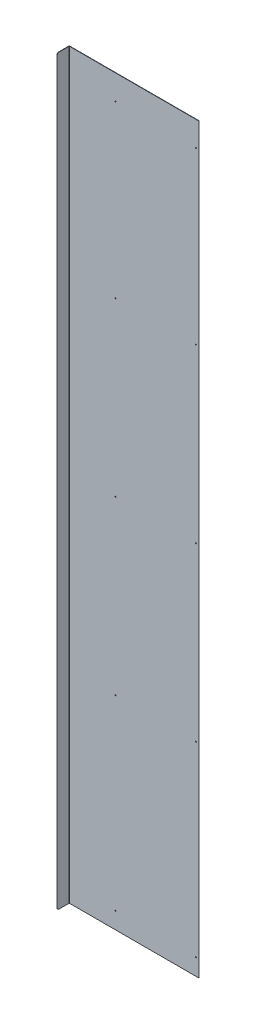
ISO-10303-21;
HEADER;
FILE_DESCRIPTION(('STEP AP214'),'2;1');
FILE_NAME('part.step','',(''),(''),'','','');
FILE_SCHEMA(('AUTOMOTIVE_DESIGN { 1 0 10303 214 1 1 1 1 }'));
ENDSEC;
DATA;
#1=APPLICATION_CONTEXT('core data for automotive mechanical design processes');
#2=APPLICATION_PROTOCOL_DEFINITION('international standard','automotive_design',2000,#1);
#3=PRODUCT_CONTEXT('',#1,'mechanical');
#4=PRODUCT('Part','Part','',(#3));
#5=PRODUCT_RELATED_PRODUCT_CATEGORY('part','',(#4));
#6=PRODUCT_DEFINITION_FORMATION('','',#4);
#7=PRODUCT_DEFINITION_CONTEXT('part definition',#1,'design');
#8=PRODUCT_DEFINITION('design','',#6,#7);
#9=PRODUCT_DEFINITION_SHAPE('','',#8);
#10=(LENGTH_UNIT() NAMED_UNIT(*) SI_UNIT(.MILLI.,.METRE.));
#11=(NAMED_UNIT(*) PLANE_ANGLE_UNIT() SI_UNIT($,.RADIAN.));
#12=(NAMED_UNIT(*) SI_UNIT($,.STERADIAN.) SOLID_ANGLE_UNIT());
#13=UNCERTAINTY_MEASURE_WITH_UNIT(LENGTH_MEASURE(1.E-05),#10,'distance_accuracy_value','');
#14=(GEOMETRIC_REPRESENTATION_CONTEXT(3) GLOBAL_UNCERTAINTY_ASSIGNED_CONTEXT((#13)) GLOBAL_UNIT_ASSIGNED_CONTEXT((#10,
#11,#12)) REPRESENTATION_CONTEXT('',''));
#15=CARTESIAN_POINT('',(0.,0.,0.));
#16=DIRECTION('',(0.,0.,1.));
#17=DIRECTION('',(1.,0.,0.));
#18=AXIS2_PLACEMENT_3D('',#15,#16,#17);
#19=CARTESIAN_POINT('',(312.642213333332,-25.,408.));
#20=DIRECTION('',(1.,0.,0.));
#21=DIRECTION('',(0.,1.,0.));
#22=AXIS2_PLACEMENT_3D('',#19,#20,#21);
#23=PLANE('',#22);
#24=DIRECTION('',(0.,1.,0.));
#25=VECTOR('',#24,1.);
#26=CARTESIAN_POINT('',(312.642213333332,0.,-0.8128));
#27=LINE('',#26,#25);
#28=CARTESIAN_POINT('',(312.642213333332,0.,-0.8128));
#29=VERTEX_POINT('',#28);
#30=CARTESIAN_POINT('',(312.642213333332,1790.7,-0.8128));
#31=VERTEX_POINT('',#30);
#32=EDGE_CURVE('E399',#29,#31,#27,.T.);
#33=ORIENTED_EDGE('',*,*,#32,.T.);
#34=DIRECTION('',(0.,0.,-1.));
#35=VECTOR('',#34,1.);
#36=CARTESIAN_POINT('',(312.642213333332,1790.7,-0.8128));
#37=LINE('',#36,#35);
#38=CARTESIAN_POINT('',(312.642213333332,1790.7,0.));
#39=VERTEX_POINT('',#38);
#40=EDGE_CURVE('E186',#39,#31,#37,.T.);
#41=ORIENTED_EDGE('',*,*,#40,.F.);
#42=DIRECTION('',(0.,1.,0.));
#43=VECTOR('',#42,1.);
#44=CARTESIAN_POINT('',(312.642213333332,0.,0.));
#45=LINE('',#44,#43);
#46=CARTESIAN_POINT('',(312.642213333332,0.,0.));
#47=VERTEX_POINT('',#46);
#48=EDGE_CURVE('E142',#47,#39,#45,.T.);
#49=ORIENTED_EDGE('',*,*,#48,.F.);
#50=DIRECTION('',(0.,0.,1.));
#51=VECTOR('',#50,1.);
#52=CARTESIAN_POINT('',(312.642213333332,0.,-0.8128));
#53=LINE('',#52,#51);
#54=EDGE_CURVE('E178',#29,#47,#53,.T.);
#55=ORIENTED_EDGE('',*,*,#54,.F.);
#56=EDGE_LOOP('',(#33,#41,#49,#55));
#57=FACE_BOUND('',#56,.T.);
#58=ADVANCED_FACE('F17',(#57),#23,.T.);
#59=CARTESIAN_POINT('',(305.642213329999,40.,0.));
#60=DIRECTION('',(0.,0.,1.));
#61=DIRECTION('',(1.,0.,0.));
#62=AXIS2_PLACEMENT_3D('',#59,#60,#61);
#63=CYLINDRICAL_SURFACE('',#62,1.21919999999998);
#64=CARTESIAN_POINT('',(305.642213329999,40.,0.));
#65=DIRECTION('',(0.,0.,1.));
#66=DIRECTION('',(1.,0.,0.));
#67=AXIS2_PLACEMENT_3D('',#64,#65,#66);
#68=CIRCLE('',#67,1.21919999999998);
#69=CARTESIAN_POINT('',(306.861413329999,40.,0.));
#70=VERTEX_POINT('',#69);
#71=EDGE_CURVE('E174',#70,#70,#68,.T.);
#72=ORIENTED_EDGE('',*,*,#71,.T.);
#73=EDGE_LOOP('',(#72));
#74=FACE_BOUND('',#73,.T.);
#75=CARTESIAN_POINT('',(305.642213329999,40.,-0.8128));
#76=DIRECTION('',(0.,0.,1.));
#77=DIRECTION('',(1.,0.,0.));
#78=AXIS2_PLACEMENT_3D('',#75,#76,#77);
#79=CIRCLE('',#78,1.21919999999998);
#80=CARTESIAN_POINT('',(306.861413329999,40.,-0.8128));
#81=VERTEX_POINT('',#80);
#82=EDGE_CURVE('E389',#81,#81,#79,.T.);
#83=ORIENTED_EDGE('',*,*,#82,.F.);
#84=EDGE_LOOP('',(#83));
#85=FACE_BOUND('',#84,.T.);
#86=ADVANCED_FACE('F355',(#74,#85),#63,.F.);
#87=CARTESIAN_POINT('',(111.558879999999,40.,0.));
#88=DIRECTION('',(0.,0.,1.));
#89=DIRECTION('',(1.,0.,0.));
#90=AXIS2_PLACEMENT_3D('',#87,#88,#89);
#91=CYLINDRICAL_SURFACE('',#90,1.2192);
#92=CARTESIAN_POINT('',(111.558879999999,40.,0.));
#93=DIRECTION('',(0.,0.,1.));
#94=DIRECTION('',(1.,0.,0.));
#95=AXIS2_PLACEMENT_3D('',#92,#93,#94);
#96=CIRCLE('',#95,1.2192);
#97=CARTESIAN_POINT('',(112.778079999999,40.,0.));
#98=VERTEX_POINT('',#97);
#99=EDGE_CURVE('E173',#98,#98,#96,.T.);
#100=ORIENTED_EDGE('',*,*,#99,.T.);
#101=EDGE_LOOP('',(#100));
#102=FACE_BOUND('',#101,.T.);
#103=CARTESIAN_POINT('',(111.558879999999,40.,-0.8128));
#104=DIRECTION('',(0.,0.,1.));
#105=DIRECTION('',(1.,0.,0.));
#106=AXIS2_PLACEMENT_3D('',#103,#104,#105);
#107=CIRCLE('',#106,1.2192);
#108=CARTESIAN_POINT('',(112.778079999999,40.,-0.8128));
#109=VERTEX_POINT('',#108);
#110=EDGE_CURVE('E124',#109,#109,#107,.T.);
#111=ORIENTED_EDGE('',*,*,#110,.F.);
#112=EDGE_LOOP('',(#111));
#113=FACE_BOUND('',#112,.T.);
#114=ADVANCED_FACE('F446',(#102,#113),#91,.F.);
#115=CARTESIAN_POINT('',(111.558879999999,490.,0.));
#116=DIRECTION('',(0.,0.,1.));
#117=DIRECTION('',(1.,0.,0.));
#118=AXIS2_PLACEMENT_3D('',#115,#116,#117);
#119=CYLINDRICAL_SURFACE('',#118,1.2192);
#120=CARTESIAN_POINT('',(111.558879999999,490.,0.));
#121=DIRECTION('',(0.,0.,1.));
#122=DIRECTION('',(1.,0.,0.));
#123=AXIS2_PLACEMENT_3D('',#120,#121,#122);
#124=CIRCLE('',#123,1.2192);
#125=CARTESIAN_POINT('',(112.778079999999,490.,0.));
#126=VERTEX_POINT('',#125);
#127=EDGE_CURVE('E169',#126,#126,#124,.T.);
#128=ORIENTED_EDGE('',*,*,#127,.T.);
#129=EDGE_LOOP('',(#128));
#130=FACE_BOUND('',#129,.T.);
#131=CARTESIAN_POINT('',(111.558879999999,490.,-0.8128));
#132=DIRECTION('',(0.,0.,1.));
#133=DIRECTION('',(1.,0.,0.));
#134=AXIS2_PLACEMENT_3D('',#131,#132,#133);
#135=CIRCLE('',#134,1.2192);
#136=CARTESIAN_POINT('',(112.778079999999,490.,-0.8128));
#137=VERTEX_POINT('',#136);
#138=EDGE_CURVE('E120',#137,#137,#135,.T.);
#139=ORIENTED_EDGE('',*,*,#138,.F.);
#140=EDGE_LOOP('',(#139));
#141=FACE_BOUND('',#140,.T.);
#142=ADVANCED_FACE('F449',(#130,#141),#119,.F.);
#143=CARTESIAN_POINT('',(305.642213329999,490.,0.));
#144=DIRECTION('',(0.,0.,1.));
#145=DIRECTION('',(1.,0.,0.));
#146=AXIS2_PLACEMENT_3D('',#143,#144,#145);
#147=CYLINDRICAL_SURFACE('',#146,1.21919999999998);
#148=CARTESIAN_POINT('',(305.642213329999,490.,0.));
#149=DIRECTION('',(0.,0.,1.));
#150=DIRECTION('',(1.,0.,0.));
#151=AXIS2_PLACEMENT_3D('',#148,#149,#150);
#152=CIRCLE('',#151,1.21919999999998);
#153=CARTESIAN_POINT('',(306.861413329999,490.,0.));
#154=VERTEX_POINT('',#153);
#155=EDGE_CURVE('E168',#154,#154,#152,.T.);
#156=ORIENTED_EDGE('',*,*,#155,.T.);
#157=EDGE_LOOP('',(#156));
#158=FACE_BOUND('',#157,.T.);
#159=CARTESIAN_POINT('',(305.642213329999,490.,-0.8128));
#160=DIRECTION('',(0.,0.,1.));
#161=DIRECTION('',(1.,0.,0.));
#162=AXIS2_PLACEMENT_3D('',#159,#160,#161);
#163=CIRCLE('',#162,1.21919999999998);
#164=CARTESIAN_POINT('',(306.861413329999,490.,-0.8128));
#165=VERTEX_POINT('',#164);
#166=EDGE_CURVE('E118',#165,#165,#163,.T.);
#167=ORIENTED_EDGE('',*,*,#166,.F.);
#168=EDGE_LOOP('',(#167));
#169=FACE_BOUND('',#168,.T.);
#170=ADVANCED_FACE('F503',(#158,#169),#147,.F.);
#171=CARTESIAN_POINT('',(305.642213329999,905.,0.));
#172=DIRECTION('',(0.,0.,1.));
#173=DIRECTION('',(1.,0.,0.));
#174=AXIS2_PLACEMENT_3D('',#171,#172,#173);
#175=CYLINDRICAL_SURFACE('',#174,1.21919999999998);
#176=CARTESIAN_POINT('',(305.642213329999,905.,0.));
#177=DIRECTION('',(0.,0.,1.));
#178=DIRECTION('',(1.,0.,0.));
#179=AXIS2_PLACEMENT_3D('',#176,#177,#178);
#180=CIRCLE('',#179,1.21919999999998);
#181=CARTESIAN_POINT('',(306.861413329999,905.,0.));
#182=VERTEX_POINT('',#181);
#183=EDGE_CURVE('E135',#182,#182,#180,.T.);
#184=ORIENTED_EDGE('',*,*,#183,.T.);
#185=EDGE_LOOP('',(#184));
#186=FACE_BOUND('',#185,.T.);
#187=CARTESIAN_POINT('',(305.642213329999,905.,-0.8128));
#188=DIRECTION('',(0.,0.,1.));
#189=DIRECTION('',(1.,0.,0.));
#190=AXIS2_PLACEMENT_3D('',#187,#188,#189);
#191=CIRCLE('',#190,1.21919999999998);
#192=CARTESIAN_POINT('',(306.861413329999,905.,-0.8128));
#193=VERTEX_POINT('',#192);
#194=EDGE_CURVE('E440',#193,#193,#191,.T.);
#195=ORIENTED_EDGE('',*,*,#194,.F.);
#196=EDGE_LOOP('',(#195));
#197=FACE_BOUND('',#196,.T.);
#198=ADVANCED_FACE('F507',(#186,#197),#175,.F.);
#199=CARTESIAN_POINT('',(111.558879999999,905.,0.));
#200=DIRECTION('',(0.,0.,1.));
#201=DIRECTION('',(1.,0.,0.));
#202=AXIS2_PLACEMENT_3D('',#199,#200,#201);
#203=CYLINDRICAL_SURFACE('',#202,1.2192);
#204=CARTESIAN_POINT('',(111.558879999999,905.,0.));
#205=DIRECTION('',(0.,0.,1.));
#206=DIRECTION('',(1.,0.,0.));
#207=AXIS2_PLACEMENT_3D('',#204,#205,#206);
#208=CIRCLE('',#207,1.2192);
#209=CARTESIAN_POINT('',(112.778079999999,905.,0.));
#210=VERTEX_POINT('',#209);
#211=EDGE_CURVE('E131',#210,#210,#208,.T.);
#212=ORIENTED_EDGE('',*,*,#211,.T.);
#213=EDGE_LOOP('',(#212));
#214=FACE_BOUND('',#213,.T.);
#215=CARTESIAN_POINT('',(111.558879999999,905.,-0.8128));
#216=DIRECTION('',(0.,0.,1.));
#217=DIRECTION('',(1.,0.,0.));
#218=AXIS2_PLACEMENT_3D('',#215,#216,#217);
#219=CIRCLE('',#218,1.2192);
#220=CARTESIAN_POINT('',(112.778079999999,905.,-0.8128));
#221=VERTEX_POINT('',#220);
#222=EDGE_CURVE('E411',#221,#221,#219,.T.);
#223=ORIENTED_EDGE('',*,*,#222,.F.);
#224=EDGE_LOOP('',(#223));
#225=FACE_BOUND('',#224,.T.);
#226=ADVANCED_FACE('F511',(#214,#225),#203,.F.);
#227=CARTESIAN_POINT('',(111.558879999999,1730.7,0.));
#228=DIRECTION('',(0.,0.,1.));
#229=DIRECTION('',(1.,0.,0.));
#230=AXIS2_PLACEMENT_3D('',#227,#228,#229);
#231=CYLINDRICAL_SURFACE('',#230,1.2192);
#232=CARTESIAN_POINT('',(111.558879999999,1730.7,0.));
#233=DIRECTION('',(0.,0.,1.));
#234=DIRECTION('',(1.,0.,0.));
#235=AXIS2_PLACEMENT_3D('',#232,#233,#234);
#236=CIRCLE('',#235,1.2192);
#237=CARTESIAN_POINT('',(112.778079999999,1730.7,0.));
#238=VERTEX_POINT('',#237);
#239=EDGE_CURVE('E136',#238,#238,#236,.T.);
#240=ORIENTED_EDGE('',*,*,#239,.T.);
#241=EDGE_LOOP('',(#240));
#242=FACE_BOUND('',#241,.T.);
#243=CARTESIAN_POINT('',(111.558879999999,1730.7,-0.8128));
#244=DIRECTION('',(0.,0.,1.));
#245=DIRECTION('',(1.,0.,0.));
#246=AXIS2_PLACEMENT_3D('',#243,#244,#245);
#247=CIRCLE('',#246,1.2192);
#248=CARTESIAN_POINT('',(112.778079999999,1730.7,-0.8128));
#249=VERTEX_POINT('',#248);
#250=EDGE_CURVE('E408',#249,#249,#247,.T.);
#251=ORIENTED_EDGE('',*,*,#250,.F.);
#252=EDGE_LOOP('',(#251));
#253=FACE_BOUND('',#252,.T.);
#254=ADVANCED_FACE('F513',(#242,#253),#231,.F.);
#255=CARTESIAN_POINT('',(305.642213329999,1730.7,0.));
#256=DIRECTION('',(0.,0.,1.));
#257=DIRECTION('',(1.,0.,0.));
#258=AXIS2_PLACEMENT_3D('',#255,#256,#257);
#259=CYLINDRICAL_SURFACE('',#258,1.21919999999998);
#260=CARTESIAN_POINT('',(305.642213329999,1730.7,0.));
#261=DIRECTION('',(0.,0.,1.));
#262=DIRECTION('',(1.,0.,0.));
#263=AXIS2_PLACEMENT_3D('',#260,#261,#262);
#264=CIRCLE('',#263,1.21919999999998);
#265=CARTESIAN_POINT('',(306.861413329999,1730.7,0.));
#266=VERTEX_POINT('',#265);
#267=EDGE_CURVE('E158',#266,#266,#264,.T.);
#268=ORIENTED_EDGE('',*,*,#267,.T.);
#269=EDGE_LOOP('',(#268));
#270=FACE_BOUND('',#269,.T.);
#271=CARTESIAN_POINT('',(305.642213329999,1730.7,-0.8128));
#272=DIRECTION('',(0.,0.,1.));
#273=DIRECTION('',(1.,0.,0.));
#274=AXIS2_PLACEMENT_3D('',#271,#272,#273);
#275=CIRCLE('',#274,1.21919999999998);
#276=CARTESIAN_POINT('',(306.861413329999,1730.7,-0.8128));
#277=VERTEX_POINT('',#276);
#278=EDGE_CURVE('E412',#277,#277,#275,.T.);
#279=ORIENTED_EDGE('',*,*,#278,.F.);
#280=EDGE_LOOP('',(#279));
#281=FACE_BOUND('',#280,.T.);
#282=ADVANCED_FACE('F516',(#270,#281),#259,.F.);
#283=CARTESIAN_POINT('',(111.558879999999,1320.,0.));
#284=DIRECTION('',(0.,0.,1.));
#285=DIRECTION('',(1.,0.,0.));
#286=AXIS2_PLACEMENT_3D('',#283,#284,#285);
#287=CYLINDRICAL_SURFACE('',#286,1.2192);
#288=CARTESIAN_POINT('',(111.558879999999,1320.,0.));
#289=DIRECTION('',(0.,0.,1.));
#290=DIRECTION('',(1.,0.,0.));
#291=AXIS2_PLACEMENT_3D('',#288,#289,#290);
#292=CIRCLE('',#291,1.2192);
#293=CARTESIAN_POINT('',(112.778079999999,1320.,0.));
#294=VERTEX_POINT('',#293);
#295=EDGE_CURVE('E150',#294,#294,#292,.T.);
#296=ORIENTED_EDGE('',*,*,#295,.T.);
#297=EDGE_LOOP('',(#296));
#298=FACE_BOUND('',#297,.T.);
#299=CARTESIAN_POINT('',(111.558879999999,1320.,-0.8128));
#300=DIRECTION('',(0.,0.,1.));
#301=DIRECTION('',(1.,0.,0.));
#302=AXIS2_PLACEMENT_3D('',#299,#300,#301);
#303=CIRCLE('',#302,1.2192);
#304=CARTESIAN_POINT('',(112.778079999999,1320.,-0.8128));
#305=VERTEX_POINT('',#304);
#306=EDGE_CURVE('E433',#305,#305,#303,.T.);
#307=ORIENTED_EDGE('',*,*,#306,.F.);
#308=EDGE_LOOP('',(#307));
#309=FACE_BOUND('',#308,.T.);
#310=ADVANCED_FACE('F520',(#298,#309),#287,.F.);
#311=CARTESIAN_POINT('',(305.642213329999,1320.,0.));
#312=DIRECTION('',(0.,0.,1.));
#313=DIRECTION('',(1.,0.,0.));
#314=AXIS2_PLACEMENT_3D('',#311,#312,#313);
#315=CYLINDRICAL_SURFACE('',#314,1.21919999999998);
#316=CARTESIAN_POINT('',(305.642213329999,1320.,0.));
#317=DIRECTION('',(0.,0.,1.));
#318=DIRECTION('',(1.,0.,0.));
#319=AXIS2_PLACEMENT_3D('',#316,#317,#318);
#320=CIRCLE('',#319,1.21919999999998);
#321=CARTESIAN_POINT('',(306.861413329999,1320.,0.));
#322=VERTEX_POINT('',#321);
#323=EDGE_CURVE('E146',#322,#322,#320,.T.);
#324=ORIENTED_EDGE('',*,*,#323,.T.);
#325=EDGE_LOOP('',(#324));
#326=FACE_BOUND('',#325,.T.);
#327=CARTESIAN_POINT('',(305.642213329999,1320.,-0.8128));
#328=DIRECTION('',(0.,0.,1.));
#329=DIRECTION('',(1.,0.,0.));
#330=AXIS2_PLACEMENT_3D('',#327,#328,#329);
#331=CIRCLE('',#330,1.21919999999998);
#332=CARTESIAN_POINT('',(306.861413329999,1320.,-0.8128));
#333=VERTEX_POINT('',#332);
#334=EDGE_CURVE('E430',#333,#333,#331,.T.);
#335=ORIENTED_EDGE('',*,*,#334,.F.);
#336=EDGE_LOOP('',(#335));
#337=FACE_BOUND('',#336,.T.);
#338=ADVANCED_FACE('F527',(#326,#337),#315,.F.);
#339=CARTESIAN_POINT('',(-0.812800000000686,1785.7,24.1872));
#340=DIRECTION('',(1.,0.,0.));
#341=DIRECTION('',(0.,0.,-1.));
#342=AXIS2_PLACEMENT_3D('',#339,#340,#341);
#343=CYLINDRICAL_SURFACE('',#342,5.);
#344=CARTESIAN_POINT('',(-0.812800000000686,1785.7,24.1872));
#345=DIRECTION('',(-1.,0.,0.));
#346=DIRECTION('',(0.,0.,-1.));
#347=AXIS2_PLACEMENT_3D('',#344,#345,#346);
#348=CIRCLE('',#347,5.);
#349=CARTESIAN_POINT('',(-0.812800000000704,1785.7,29.1872));
#350=VERTEX_POINT('',#349);
#351=CARTESIAN_POINT('',(-0.812800000000688,1790.7,24.1872));
#352=VERTEX_POINT('',#351);
#353=EDGE_CURVE('E70',#350,#352,#348,.T.);
#354=ORIENTED_EDGE('',*,*,#353,.F.);
#355=DIRECTION('',(-1.,0.,0.));
#356=VECTOR('',#355,1.);
#357=CARTESIAN_POINT('',(-0.812800000000704,1785.7,29.1872));
#358=LINE('',#357,#356);
#359=CARTESIAN_POINT('',(-7.03904725436495E-13,1785.7,29.1872));
#360=VERTEX_POINT('',#359);
#361=EDGE_CURVE('E11',#360,#350,#358,.T.);
#362=ORIENTED_EDGE('',*,*,#361,.F.);
#363=CARTESIAN_POINT('',(-6.86408395400573E-13,1785.7,24.1872));
#364=DIRECTION('',(1.,0.,0.));
#365=DIRECTION('',(0.,0.,-1.));
#366=AXIS2_PLACEMENT_3D('',#363,#364,#365);
#367=CIRCLE('',#366,5.);
#368=CARTESIAN_POINT('',(-6.88132927078795E-13,1790.7,24.1872));
#369=VERTEX_POINT('',#368);
#370=EDGE_CURVE('E96',#369,#360,#367,.T.);
#371=ORIENTED_EDGE('',*,*,#370,.F.);
#372=DIRECTION('',(1.,0.,0.));
#373=VECTOR('',#372,1.);
#374=CARTESIAN_POINT('',(-0.812800000000688,1790.7,24.1872));
#375=LINE('',#374,#373);
#376=EDGE_CURVE('E74',#352,#369,#375,.T.);
#377=ORIENTED_EDGE('',*,*,#376,.F.);
#378=EDGE_LOOP('',(#354,#362,#371,#377));
#379=FACE_BOUND('',#378,.T.);
#380=ADVANCED_FACE('F71',(#379),#343,.T.);
#381=CARTESIAN_POINT('',(-0.812800000000086,4.99999999999989,24.1872));
#382=DIRECTION('',(1.,0.,0.));
#383=DIRECTION('',(0.,0.,-1.));
#384=AXIS2_PLACEMENT_3D('',#381,#382,#383);
#385=CYLINDRICAL_SURFACE('',#384,5.);
#386=CARTESIAN_POINT('',(-0.812800000000086,4.99999999999989,24.1872));
#387=DIRECTION('',(-1.,0.,0.));
#388=DIRECTION('',(0.,0.,-1.));
#389=AXIS2_PLACEMENT_3D('',#386,#387,#388);
#390=CIRCLE('',#389,5.);
#391=CARTESIAN_POINT('',(-0.812800000000084,0.,24.1872));
#392=VERTEX_POINT('',#391);
#393=CARTESIAN_POINT('',(-0.812800000000104,4.99999999999989,29.1872));
#394=VERTEX_POINT('',#393);
#395=EDGE_CURVE('E82',#392,#394,#390,.T.);
#396=ORIENTED_EDGE('',*,*,#395,.F.);
#397=DIRECTION('',(-1.,0.,0.));
#398=VECTOR('',#397,1.);
#399=CARTESIAN_POINT('',(-0.812800000000084,0.,24.1872));
#400=LINE('',#399,#398);
#401=CARTESIAN_POINT('',(0.,0.,24.1872));
#402=VERTEX_POINT('',#401);
#403=EDGE_CURVE('E106',#402,#392,#400,.T.);
#404=ORIENTED_EDGE('',*,*,#403,.F.);
#405=CARTESIAN_POINT('',(0.,4.99999999999989,24.1872));
#406=DIRECTION('',(1.,0.,0.));
#407=DIRECTION('',(0.,0.,-1.));
#408=AXIS2_PLACEMENT_3D('',#405,#406,#407);
#409=CIRCLE('',#408,5.);
#410=CARTESIAN_POINT('',(-1.03592172469598E-13,4.99999999999989,29.1872));
#411=VERTEX_POINT('',#410);
#412=EDGE_CURVE('E93',#411,#402,#409,.T.);
#413=ORIENTED_EDGE('',*,*,#412,.F.);
#414=DIRECTION('',(1.,0.,0.));
#415=VECTOR('',#414,1.);
#416=CARTESIAN_POINT('',(-0.812800000000104,4.99999999999989,29.1872));
#417=LINE('',#416,#415);
#418=EDGE_CURVE('E26',#394,#411,#417,.T.);
#419=ORIENTED_EDGE('',*,*,#418,.F.);
#420=EDGE_LOOP('',(#396,#404,#413,#419));
#421=FACE_BOUND('',#420,.T.);
#422=ADVANCED_FACE('F104',(#421),#385,.T.);
#423=CARTESIAN_POINT('',(-0.812800000000706,1790.7,29.1872));
#424=DIRECTION('',(0.,0.,-1.));
#425=DIRECTION('',(0.,-1.,0.));
#426=AXIS2_PLACEMENT_3D('',#423,#424,#425);
#427=PLANE('',#426);
#428=DIRECTION('',(0.,1.,0.));
#429=VECTOR('',#428,1.);
#430=CARTESIAN_POINT('',(-0.812800000000706,1790.7,29.1872));
#431=LINE('',#430,#429);
#432=EDGE_CURVE('E64',#394,#350,#431,.T.);
#433=ORIENTED_EDGE('',*,*,#432,.F.);
#434=ORIENTED_EDGE('',*,*,#418,.T.);
#435=DIRECTION('',(0.,1.,0.));
#436=VECTOR('',#435,1.);
#437=CARTESIAN_POINT('',(-7.05590333773011E-13,1790.7,29.1872));
#438=LINE('',#437,#436);
#439=EDGE_CURVE('E67',#411,#360,#438,.T.);
#440=ORIENTED_EDGE('',*,*,#439,.T.);
#441=ORIENTED_EDGE('',*,*,#361,.T.);
#442=EDGE_LOOP('',(#433,#434,#440,#441));
#443=FACE_BOUND('',#442,.T.);
#444=ADVANCED_FACE('F62',(#443),#427,.F.);
#445=CARTESIAN_POINT('',(0.,0.,0.));
#446=DIRECTION('',(1.,0.,0.));
#447=DIRECTION('',(0.,0.,1.));
#448=AXIS2_PLACEMENT_3D('',#445,#446,#447);
#449=PLANE('',#448);
#450=ORIENTED_EDGE('',*,*,#439,.F.);
#451=ORIENTED_EDGE('',*,*,#412,.T.);
#452=DIRECTION('',(0.,0.,1.));
#453=VECTOR('',#452,1.);
#454=CARTESIAN_POINT('',(-1.01906564133082E-13,0.,29.1872));
#455=LINE('',#454,#453);
#456=CARTESIAN_POINT('',(-1.28803218091278E-13,0.,0.812799999999886));
#457=VERTEX_POINT('',#456);
#458=EDGE_CURVE('E216',#457,#402,#455,.T.);
#459=ORIENTED_EDGE('',*,*,#458,.F.);
#460=DIRECTION('',(0.,-1.,0.));
#461=VECTOR('',#460,1.);
#462=CARTESIAN_POINT('',(-6.0652164567214E-13,1790.7,0.8128));
#463=LINE('',#462,#461);
#464=CARTESIAN_POINT('',(-6.06502695288391E-13,1790.7,0.8128));
#465=VERTEX_POINT('',#464);
#466=EDGE_CURVE('E207',#465,#457,#463,.T.);
#467=ORIENTED_EDGE('',*,*,#466,.F.);
#468=DIRECTION('',(0.,0.,-1.));
#469=VECTOR('',#468,1.);
#470=CARTESIAN_POINT('',(-6.03683769639929E-13,1790.7,0.));
#471=LINE('',#470,#469);
#472=EDGE_CURVE('E153',#369,#465,#471,.T.);
#473=ORIENTED_EDGE('',*,*,#472,.F.);
#474=ORIENTED_EDGE('',*,*,#370,.T.);
#475=EDGE_LOOP('',(#450,#451,#459,#467,#473,#474));
#476=FACE_BOUND('',#475,.T.);
#477=ADVANCED_FACE('F110',(#476),#449,.T.);
#478=CARTESIAN_POINT('',(-0.8128,0.,0.));
#479=DIRECTION('',(1.,0.,0.));
#480=DIRECTION('',(0.,0.,1.));
#481=AXIS2_PLACEMENT_3D('',#478,#479,#480);
#482=PLANE('',#481);
#483=DIRECTION('',(0.,0.,1.));
#484=VECTOR('',#483,1.);
#485=CARTESIAN_POINT('',(-0.812800000000102,0.,29.1872));
#486=LINE('',#485,#484);
#487=CARTESIAN_POINT('',(-0.812800000000305,0.,0.812799999999891));
#488=VERTEX_POINT('',#487);
#489=EDGE_CURVE('E89',#488,#392,#486,.T.);
#490=ORIENTED_EDGE('',*,*,#489,.T.);
#491=ORIENTED_EDGE('',*,*,#395,.T.);
#492=ORIENTED_EDGE('',*,*,#432,.T.);
#493=ORIENTED_EDGE('',*,*,#353,.T.);
#494=DIRECTION('',(0.,0.,-1.));
#495=VECTOR('',#494,1.);
#496=CARTESIAN_POINT('',(-0.812800000000604,1790.7,0.));
#497=LINE('',#496,#495);
#498=CARTESIAN_POINT('',(-0.812800000000606,1790.7,0.8128));
#499=VERTEX_POINT('',#498);
#500=EDGE_CURVE('E154',#352,#499,#497,.T.);
#501=ORIENTED_EDGE('',*,*,#500,.T.);
#502=DIRECTION('',(0.,1.,0.));
#503=VECTOR('',#502,1.);
#504=CARTESIAN_POINT('',(-0.8128,0.,0.812799999999891));
#505=LINE('',#504,#503);
#506=EDGE_CURVE('E129',#488,#499,#505,.T.);
#507=ORIENTED_EDGE('',*,*,#506,.F.);
#508=EDGE_LOOP('',(#490,#491,#492,#493,#501,#507));
#509=FACE_BOUND('',#508,.T.);
#510=ADVANCED_FACE('F81',(#509),#482,.F.);
#511=CARTESIAN_POINT('',(-0.812800000000102,0.,29.1872));
#512=DIRECTION('',(0.,1.,0.));
#513=DIRECTION('',(1.,0.,0.));
#514=AXIS2_PLACEMENT_3D('',#511,#512,#513);
#515=PLANE('',#514);
#516=ORIENTED_EDGE('',*,*,#458,.T.);
#517=ORIENTED_EDGE('',*,*,#403,.T.);
#518=ORIENTED_EDGE('',*,*,#489,.F.);
#519=DIRECTION('',(-1.,0.,0.));
#520=VECTOR('',#519,1.);
#521=CARTESIAN_POINT('',(0.,0.,0.812799999999894));
#522=LINE('',#521,#520);
#523=EDGE_CURVE('E130',#457,#488,#522,.T.);
#524=ORIENTED_EDGE('',*,*,#523,.F.);
#525=EDGE_LOOP('',(#516,#517,#518,#524));
#526=FACE_BOUND('',#525,.T.);
#527=ADVANCED_FACE('F230',(#526),#515,.F.);
#528=CARTESIAN_POINT('',(-0.812800000000604,1790.7,0.));
#529=DIRECTION('',(0.,-1.,0.));
#530=DIRECTION('',(0.,0.,-1.));
#531=AXIS2_PLACEMENT_3D('',#528,#529,#530);
#532=PLANE('',#531);
#533=ORIENTED_EDGE('',*,*,#500,.F.);
#534=ORIENTED_EDGE('',*,*,#376,.T.);
#535=ORIENTED_EDGE('',*,*,#472,.T.);
#536=DIRECTION('',(-1.,0.,0.));
#537=VECTOR('',#536,1.);
#538=CARTESIAN_POINT('',(-6.0652164567214E-13,1790.7,0.8128));
#539=LINE('',#538,#537);
#540=EDGE_CURVE('E191',#465,#499,#539,.T.);
#541=ORIENTED_EDGE('',*,*,#540,.T.);
#542=EDGE_LOOP('',(#533,#534,#535,#541));
#543=FACE_BOUND('',#542,.T.);
#544=ADVANCED_FACE('F256',(#543),#532,.F.);
#545=CARTESIAN_POINT('',(0.812799999999934,0.,0.812799999999889));
#546=DIRECTION('',(0.,-1.,0.));
#547=DIRECTION('',(-1.,0.,0.));
#548=AXIS2_PLACEMENT_3D('',#545,#546,#547);
#549=CYLINDRICAL_SURFACE('',#548,0.812800000000063);
#550=DIRECTION('',(0.,1.,0.));
#551=VECTOR('',#550,1.);
#552=CARTESIAN_POINT('',(0.8128,0.,-1.7423128911842E-13));
#553=LINE('',#552,#551);
#554=CARTESIAN_POINT('',(0.8128,0.,-1.7423128911842E-13));
#555=VERTEX_POINT('',#554);
#556=CARTESIAN_POINT('',(0.81279999999952,1790.7,0.));
#557=VERTEX_POINT('',#556);
#558=EDGE_CURVE('E141',#555,#557,#553,.T.);
#559=ORIENTED_EDGE('',*,*,#558,.T.);
#560=CARTESIAN_POINT('',(0.812799999999456,1790.7,0.8128));
#561=DIRECTION('',(0.,1.,0.));
#562=DIRECTION('',(1.,0.,0.));
#563=AXIS2_PLACEMENT_3D('',#560,#561,#562);
#564=CIRCLE('',#563,0.812800000000063);
#565=EDGE_CURVE('E195',#557,#465,#564,.T.);
#566=ORIENTED_EDGE('',*,*,#565,.T.);
#567=ORIENTED_EDGE('',*,*,#466,.T.);
#568=CARTESIAN_POINT('',(0.812799999999934,0.,0.812799999999889));
#569=DIRECTION('',(0.,-1.,0.));
#570=DIRECTION('',(1.,0.,0.));
#571=AXIS2_PLACEMENT_3D('',#568,#569,#570);
#572=CIRCLE('',#571,0.812800000000063);
#573=EDGE_CURVE('E203',#457,#555,#572,.T.);
#574=ORIENTED_EDGE('',*,*,#573,.T.);
#575=EDGE_LOOP('',(#559,#566,#567,#574));
#576=FACE_BOUND('',#575,.T.);
#577=ADVANCED_FACE('F240',(#576),#549,.F.);
#578=CARTESIAN_POINT('',(0.812799999999934,0.,0.812799999999889));
#579=DIRECTION('',(0.,-1.,0.));
#580=DIRECTION('',(-1.,0.,0.));
#581=AXIS2_PLACEMENT_3D('',#578,#579,#580);
#582=CYLINDRICAL_SURFACE('',#581,1.62560000000006);
#583=DIRECTION('',(0.,1.,0.));
#584=VECTOR('',#583,1.);
#585=CARTESIAN_POINT('',(0.81280000000006,0.,-0.812800000000174));
#586=LINE('',#585,#584);
#587=CARTESIAN_POINT('',(0.81280000000006,0.,-0.812800000000174));
#588=VERTEX_POINT('',#587);
#589=CARTESIAN_POINT('',(0.81279999999952,1790.7,-0.8128));
#590=VERTEX_POINT('',#589);
#591=EDGE_CURVE('E416',#588,#590,#586,.T.);
#592=ORIENTED_EDGE('',*,*,#591,.F.);
#593=CARTESIAN_POINT('',(0.812799999999934,0.,0.812799999999889));
#594=DIRECTION('',(0.,-1.,0.));
#595=DIRECTION('',(1.,0.,0.));
#596=AXIS2_PLACEMENT_3D('',#593,#594,#595);
#597=CIRCLE('',#596,1.62560000000006);
#598=EDGE_CURVE('E125',#488,#588,#597,.T.);
#599=ORIENTED_EDGE('',*,*,#598,.F.);
#600=ORIENTED_EDGE('',*,*,#506,.T.);
#601=CARTESIAN_POINT('',(0.812799999999456,1790.7,0.8128));
#602=DIRECTION('',(0.,1.,0.));
#603=DIRECTION('',(1.,0.,0.));
#604=AXIS2_PLACEMENT_3D('',#601,#602,#603);
#605=CIRCLE('',#604,1.62560000000006);
#606=EDGE_CURVE('E199',#590,#499,#605,.T.);
#607=ORIENTED_EDGE('',*,*,#606,.F.);
#608=EDGE_LOOP('',(#592,#599,#600,#607));
#609=FACE_BOUND('',#608,.T.);
#610=ADVANCED_FACE('F544',(#609),#582,.T.);
#611=CARTESIAN_POINT('',(0.812799999999934,0.,0.812799999999889));
#612=DIRECTION('',(0.,1.,0.));
#613=DIRECTION('',(1.,0.,0.));
#614=AXIS2_PLACEMENT_3D('',#611,#612,#613);
#615=PLANE('',#614);
#616=ORIENTED_EDGE('',*,*,#573,.F.);
#617=ORIENTED_EDGE('',*,*,#523,.T.);
#618=ORIENTED_EDGE('',*,*,#598,.T.);
#619=DIRECTION('',(0.,0.,-1.));
#620=VECTOR('',#619,1.);
#621=CARTESIAN_POINT('',(0.8128,0.,-1.7423128911842E-13));
#622=LINE('',#621,#620);
#623=EDGE_CURVE('E182',#555,#588,#622,.T.);
#624=ORIENTED_EDGE('',*,*,#623,.F.);
#625=EDGE_LOOP('',(#616,#617,#618,#624));
#626=FACE_BOUND('',#625,.T.);
#627=ADVANCED_FACE('F547',(#626),#615,.F.);
#628=CARTESIAN_POINT('',(0.812799999999456,1790.7,0.8128));
#629=DIRECTION('',(0.,1.,0.));
#630=DIRECTION('',(1.,0.,0.));
#631=AXIS2_PLACEMENT_3D('',#628,#629,#630);
#632=PLANE('',#631);
#633=ORIENTED_EDGE('',*,*,#540,.F.);
#634=ORIENTED_EDGE('',*,*,#565,.F.);
#635=DIRECTION('',(0.,0.,-1.));
#636=VECTOR('',#635,1.);
#637=CARTESIAN_POINT('',(0.81279999999952,1790.7,0.));
#638=LINE('',#637,#636);
#639=EDGE_CURVE('E190',#557,#590,#638,.T.);
#640=ORIENTED_EDGE('',*,*,#639,.T.);
#641=ORIENTED_EDGE('',*,*,#606,.T.);
#642=EDGE_LOOP('',(#633,#634,#640,#641));
#643=FACE_BOUND('',#642,.T.);
#644=ADVANCED_FACE('F253',(#643),#632,.T.);
#645=CARTESIAN_POINT('',(-5.55111512312578E-13,1790.7,-0.8128));
#646=DIRECTION('',(0.,1.,0.));
#647=DIRECTION('',(1.,0.,0.));
#648=AXIS2_PLACEMENT_3D('',#645,#646,#647);
#649=PLANE('',#648);
#650=DIRECTION('',(-1.,0.,0.));
#651=VECTOR('',#650,1.);
#652=CARTESIAN_POINT('',(-5.55111512312578E-13,1790.7,0.));
#653=LINE('',#652,#651);
#654=EDGE_CURVE('E137',#39,#557,#653,.T.);
#655=ORIENTED_EDGE('',*,*,#654,.F.);
#656=ORIENTED_EDGE('',*,*,#40,.T.);
#657=DIRECTION('',(-1.,0.,0.));
#658=VECTOR('',#657,1.);
#659=CARTESIAN_POINT('',(-5.55111512312578E-13,1790.7,-0.8128));
#660=LINE('',#659,#658);
#661=EDGE_CURVE('E422',#31,#590,#660,.T.);
#662=ORIENTED_EDGE('',*,*,#661,.T.);
#663=ORIENTED_EDGE('',*,*,#639,.F.);
#664=EDGE_LOOP('',(#655,#656,#662,#663));
#665=FACE_BOUND('',#664,.T.);
#666=ADVANCED_FACE('F553',(#665),#649,.T.);
#667=CARTESIAN_POINT('',(0.,0.,-0.8128));
#668=DIRECTION('',(0.,-1.,0.));
#669=DIRECTION('',(-1.,0.,0.));
#670=AXIS2_PLACEMENT_3D('',#667,#668,#669);
#671=PLANE('',#670);
#672=DIRECTION('',(1.,0.,0.));
#673=VECTOR('',#672,1.);
#674=CARTESIAN_POINT('',(0.,0.,-0.8128));
#675=LINE('',#674,#673);
#676=EDGE_CURVE('E403',#588,#29,#675,.T.);
#677=ORIENTED_EDGE('',*,*,#676,.T.);
#678=ORIENTED_EDGE('',*,*,#54,.T.);
#679=DIRECTION('',(1.,0.,0.));
#680=VECTOR('',#679,1.);
#681=CARTESIAN_POINT('',(0.,0.,0.));
#682=LINE('',#681,#680);
#683=EDGE_CURVE('E385',#555,#47,#682,.T.);
#684=ORIENTED_EDGE('',*,*,#683,.F.);
#685=ORIENTED_EDGE('',*,*,#623,.T.);
#686=EDGE_LOOP('',(#677,#678,#684,#685));
#687=FACE_BOUND('',#686,.T.);
#688=ADVANCED_FACE('F362',(#687),#671,.T.);
#689=CARTESIAN_POINT('',(0.,0.,0.));
#690=DIRECTION('',(0.,0.,1.));
#691=DIRECTION('',(1.,0.,0.));
#692=AXIS2_PLACEMENT_3D('',#689,#690,#691);
#693=PLANE('',#692);
#694=ORIENTED_EDGE('',*,*,#71,.F.);
#695=EDGE_LOOP('',(#694));
#696=FACE_BOUND('',#695,.T.);
#697=ORIENTED_EDGE('',*,*,#99,.F.);
#698=EDGE_LOOP('',(#697));
#699=FACE_BOUND('',#698,.T.);
#700=ORIENTED_EDGE('',*,*,#127,.F.);
#701=EDGE_LOOP('',(#700));
#702=FACE_BOUND('',#701,.T.);
#703=ORIENTED_EDGE('',*,*,#155,.F.);
#704=EDGE_LOOP('',(#703));
#705=FACE_BOUND('',#704,.T.);
#706=ORIENTED_EDGE('',*,*,#183,.F.);
#707=EDGE_LOOP('',(#706));
#708=FACE_BOUND('',#707,.T.);
#709=ORIENTED_EDGE('',*,*,#211,.F.);
#710=EDGE_LOOP('',(#709));
#711=FACE_BOUND('',#710,.T.);
#712=ORIENTED_EDGE('',*,*,#239,.F.);
#713=EDGE_LOOP('',(#712));
#714=FACE_BOUND('',#713,.T.);
#715=ORIENTED_EDGE('',*,*,#267,.F.);
#716=EDGE_LOOP('',(#715));
#717=FACE_BOUND('',#716,.T.);
#718=ORIENTED_EDGE('',*,*,#295,.F.);
#719=EDGE_LOOP('',(#718));
#720=FACE_BOUND('',#719,.T.);
#721=ORIENTED_EDGE('',*,*,#323,.F.);
#722=EDGE_LOOP('',(#721));
#723=FACE_BOUND('',#722,.T.);
#724=ORIENTED_EDGE('',*,*,#683,.T.);
#725=ORIENTED_EDGE('',*,*,#48,.T.);
#726=ORIENTED_EDGE('',*,*,#654,.T.);
#727=ORIENTED_EDGE('',*,*,#558,.F.);
#728=EDGE_LOOP('',(#724,#725,#726,#727));
#729=FACE_BOUND('',#728,.T.);
#730=ADVANCED_FACE('F358',(#696,#699,#702,#705,#708,#711,#714,#717,#720,#723,#729),#693,.T.);
#731=CARTESIAN_POINT('',(0.,0.,-0.8128));
#732=DIRECTION('',(0.,0.,1.));
#733=DIRECTION('',(1.,0.,0.));
#734=AXIS2_PLACEMENT_3D('',#731,#732,#733);
#735=PLANE('',#734);
#736=ORIENTED_EDGE('',*,*,#82,.T.);
#737=EDGE_LOOP('',(#736));
#738=FACE_BOUND('',#737,.T.);
#739=ORIENTED_EDGE('',*,*,#110,.T.);
#740=EDGE_LOOP('',(#739));
#741=FACE_BOUND('',#740,.T.);
#742=ORIENTED_EDGE('',*,*,#138,.T.);
#743=EDGE_LOOP('',(#742));
#744=FACE_BOUND('',#743,.T.);
#745=ORIENTED_EDGE('',*,*,#166,.T.);
#746=EDGE_LOOP('',(#745));
#747=FACE_BOUND('',#746,.T.);
#748=ORIENTED_EDGE('',*,*,#194,.T.);
#749=EDGE_LOOP('',(#748));
#750=FACE_BOUND('',#749,.T.);
#751=ORIENTED_EDGE('',*,*,#222,.T.);
#752=EDGE_LOOP('',(#751));
#753=FACE_BOUND('',#752,.T.);
#754=ORIENTED_EDGE('',*,*,#250,.T.);
#755=EDGE_LOOP('',(#754));
#756=FACE_BOUND('',#755,.T.);
#757=ORIENTED_EDGE('',*,*,#278,.T.);
#758=EDGE_LOOP('',(#757));
#759=FACE_BOUND('',#758,.T.);
#760=ORIENTED_EDGE('',*,*,#306,.T.);
#761=EDGE_LOOP('',(#760));
#762=FACE_BOUND('',#761,.T.);
#763=ORIENTED_EDGE('',*,*,#334,.T.);
#764=EDGE_LOOP('',(#763));
#765=FACE_BOUND('',#764,.T.);
#766=ORIENTED_EDGE('',*,*,#32,.F.);
#767=ORIENTED_EDGE('',*,*,#676,.F.);
#768=ORIENTED_EDGE('',*,*,#591,.T.);
#769=ORIENTED_EDGE('',*,*,#661,.F.);
#770=EDGE_LOOP('',(#766,#767,#768,#769));
#771=FACE_BOUND('',#770,.T.);
#772=ADVANCED_FACE('F361',(#738,#741,#744,#747,#750,#753,#756,#759,#762,#765,#771),#735,.F.);
#773=CLOSED_SHELL('',(#58,#86,#114,#142,#170,#198,#226,#254,#282,#310,#338,#380,#422,#444,#477,
#510,#527,#544,#577,#610,#627,#644,#666,#688,#730,#772));
#774=MANIFOLD_SOLID_BREP('B1',#773);
#775=ADVANCED_BREP_SHAPE_REPRESENTATION('',(#18,#774),#14);
#776=SHAPE_DEFINITION_REPRESENTATION(#9,#775);
ENDSEC;
END-ISO-10303-21;
